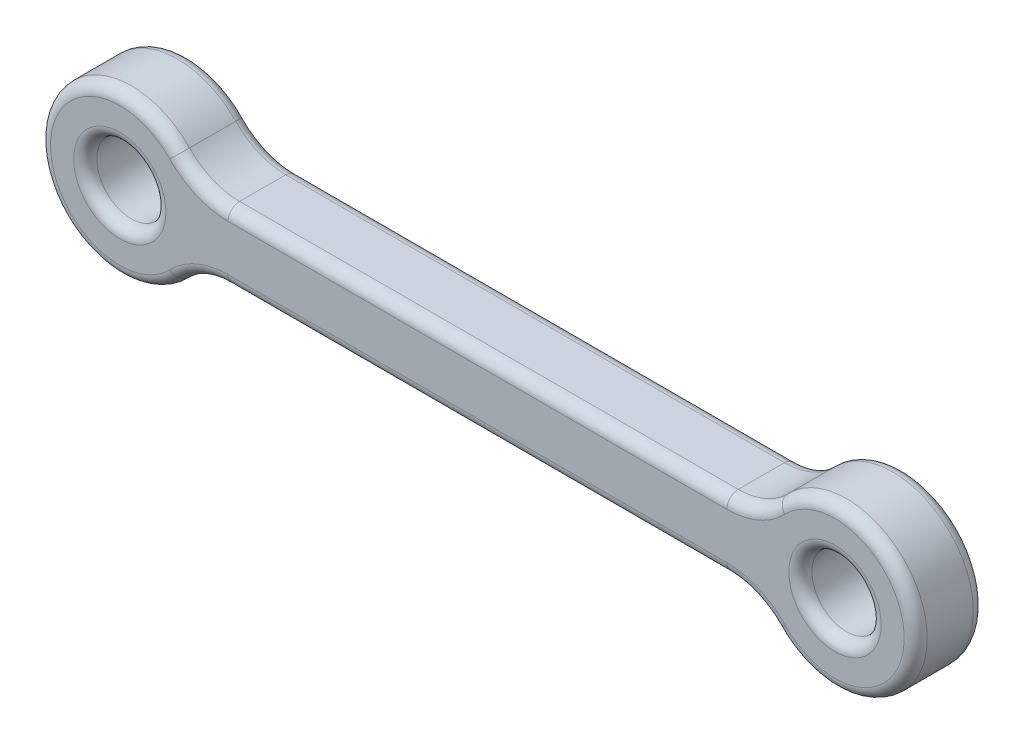
ISO-10303-21;
HEADER;
FILE_DESCRIPTION(('STEP AP214'),'2;1');
FILE_NAME('part.step','',(''),(''),'','','');
FILE_SCHEMA(('AUTOMOTIVE_DESIGN { 1 0 10303 214 1 1 1 1 }'));
ENDSEC;
DATA;
#1=APPLICATION_CONTEXT('core data for automotive mechanical design processes');
#2=APPLICATION_PROTOCOL_DEFINITION('international standard','automotive_design',2000,#1);
#3=PRODUCT_CONTEXT('',#1,'mechanical');
#4=PRODUCT('Part','Part','',(#3));
#5=PRODUCT_RELATED_PRODUCT_CATEGORY('part','',(#4));
#6=PRODUCT_DEFINITION_FORMATION('','',#4);
#7=PRODUCT_DEFINITION_CONTEXT('part definition',#1,'design');
#8=PRODUCT_DEFINITION('design','',#6,#7);
#9=PRODUCT_DEFINITION_SHAPE('','',#8);
#10=(LENGTH_UNIT() NAMED_UNIT(*) SI_UNIT(.MILLI.,.METRE.));
#11=(NAMED_UNIT(*) PLANE_ANGLE_UNIT() SI_UNIT($,.RADIAN.));
#12=(NAMED_UNIT(*) SI_UNIT($,.STERADIAN.) SOLID_ANGLE_UNIT());
#13=UNCERTAINTY_MEASURE_WITH_UNIT(LENGTH_MEASURE(1.E-05),#10,'distance_accuracy_value','');
#14=(GEOMETRIC_REPRESENTATION_CONTEXT(3) GLOBAL_UNCERTAINTY_ASSIGNED_CONTEXT((#13)) GLOBAL_UNIT_ASSIGNED_CONTEXT((#10,
#11,#12)) REPRESENTATION_CONTEXT('',''));
#15=CARTESIAN_POINT('',(0.,0.,0.));
#16=DIRECTION('',(0.,0.,1.));
#17=DIRECTION('',(1.,0.,0.));
#18=AXIS2_PLACEMENT_3D('',#15,#16,#17);
#19=CARTESIAN_POINT('',(26.3095842401766,4.5,-3.));
#20=DIRECTION('',(0.,0.,1.));
#21=DIRECTION('',(1.,0.,0.));
#22=AXIS2_PLACEMENT_3D('',#19,#20,#21);
#23=CYLINDRICAL_SURFACE('',#22,3.);
#24=DIRECTION('',(0.,0.,1.));
#25=VECTOR('',#24,1.);
#26=CARTESIAN_POINT('',(28.4743915139412,2.42307692307692,-3.));
#27=LINE('',#26,#25);
#28=CARTESIAN_POINT('',(28.4743915139412,2.42307692307692,-2.5));
#29=VERTEX_POINT('',#28);
#30=CARTESIAN_POINT('',(28.4743915139412,2.42307692307692,-0.5));
#31=VERTEX_POINT('',#30);
#32=EDGE_CURVE('E153',#29,#31,#27,.T.);
#33=ORIENTED_EDGE('',*,*,#32,.F.);
#34=CARTESIAN_POINT('',(26.3095842401766,4.5,-2.5));
#35=DIRECTION('',(0.,0.,1.));
#36=DIRECTION('',(1.,0.,0.));
#37=AXIS2_PLACEMENT_3D('',#34,#35,#36);
#38=CIRCLE('',#37,3.);
#39=CARTESIAN_POINT('',(26.3095842401766,1.5,-2.5));
#40=VERTEX_POINT('',#39);
#41=EDGE_CURVE('E168',#29,#40,#38,.F.);
#42=ORIENTED_EDGE('',*,*,#41,.T.);
#43=DIRECTION('',(0.,0.,1.));
#44=VECTOR('',#43,1.);
#45=CARTESIAN_POINT('',(26.3095842401766,1.5,-3.));
#46=LINE('',#45,#44);
#47=CARTESIAN_POINT('',(26.3095842401766,1.5,-0.5));
#48=VERTEX_POINT('',#47);
#49=EDGE_CURVE('E331',#40,#48,#46,.T.);
#50=ORIENTED_EDGE('',*,*,#49,.T.);
#51=CARTESIAN_POINT('',(26.3095842401766,4.5,-0.5));
#52=DIRECTION('',(0.,0.,1.));
#53=DIRECTION('',(1.,0.,0.));
#54=AXIS2_PLACEMENT_3D('',#51,#52,#53);
#55=CIRCLE('',#54,3.);
#56=EDGE_CURVE('E171',#48,#31,#55,.T.);
#57=ORIENTED_EDGE('',*,*,#56,.T.);
#58=EDGE_LOOP('',(#33,#42,#50,#57));
#59=FACE_BOUND('',#58,.T.);
#60=ADVANCED_FACE('F35',(#59),#23,.F.);
#61=CARTESIAN_POINT('',(31.,0.,-3.));
#62=DIRECTION('',(0.,0.,1.));
#63=DIRECTION('',(1.,0.,0.));
#64=AXIS2_PLACEMENT_3D('',#61,#62,#63);
#65=CYLINDRICAL_SURFACE('',#64,3.5);
#66=DIRECTION('',(0.,0.,1.));
#67=VECTOR('',#66,1.);
#68=CARTESIAN_POINT('',(28.4743915139412,-2.42307692307692,-3.));
#69=LINE('',#68,#67);
#70=CARTESIAN_POINT('',(28.4743915139412,-2.42307692307692,-2.5));
#71=VERTEX_POINT('',#70);
#72=CARTESIAN_POINT('',(28.4743915139412,-2.42307692307692,-0.5));
#73=VERTEX_POINT('',#72);
#74=EDGE_CURVE('E155',#71,#73,#69,.T.);
#75=ORIENTED_EDGE('',*,*,#74,.F.);
#76=CARTESIAN_POINT('',(31.,0.,-2.5));
#77=DIRECTION('',(0.,0.,1.));
#78=DIRECTION('',(1.,0.,0.));
#79=AXIS2_PLACEMENT_3D('',#76,#77,#78);
#80=CIRCLE('',#79,3.5);
#81=EDGE_CURVE('E150',#71,#29,#80,.T.);
#82=ORIENTED_EDGE('',*,*,#81,.T.);
#83=ORIENTED_EDGE('',*,*,#32,.T.);
#84=CARTESIAN_POINT('',(31.,0.,-0.5));
#85=DIRECTION('',(0.,0.,1.));
#86=DIRECTION('',(1.,0.,0.));
#87=AXIS2_PLACEMENT_3D('',#84,#85,#86);
#88=CIRCLE('',#87,3.5);
#89=EDGE_CURVE('E161',#31,#73,#88,.F.);
#90=ORIENTED_EDGE('',*,*,#89,.T.);
#91=EDGE_LOOP('',(#75,#82,#83,#90));
#92=FACE_BOUND('',#91,.T.);
#93=ADVANCED_FACE('F152',(#92),#65,.T.);
#94=CARTESIAN_POINT('',(26.3095842401766,-4.5,-3.));
#95=DIRECTION('',(0.,0.,1.));
#96=DIRECTION('',(1.,0.,0.));
#97=AXIS2_PLACEMENT_3D('',#94,#95,#96);
#98=CYLINDRICAL_SURFACE('',#97,3.);
#99=DIRECTION('',(0.,0.,1.));
#100=VECTOR('',#99,1.);
#101=CARTESIAN_POINT('',(26.3095842401766,-1.5,-3.));
#102=LINE('',#101,#100);
#103=CARTESIAN_POINT('',(26.3095842401766,-1.5,-2.5));
#104=VERTEX_POINT('',#103);
#105=CARTESIAN_POINT('',(26.3095842401766,-1.5,-0.5));
#106=VERTEX_POINT('',#105);
#107=EDGE_CURVE('E324',#104,#106,#102,.T.);
#108=ORIENTED_EDGE('',*,*,#107,.F.);
#109=CARTESIAN_POINT('',(26.3095842401766,-4.5,-2.5));
#110=DIRECTION('',(0.,0.,1.));
#111=DIRECTION('',(1.,0.,0.));
#112=AXIS2_PLACEMENT_3D('',#109,#110,#111);
#113=CIRCLE('',#112,3.);
#114=EDGE_CURVE('E210',#104,#71,#113,.F.);
#115=ORIENTED_EDGE('',*,*,#114,.T.);
#116=ORIENTED_EDGE('',*,*,#74,.T.);
#117=CARTESIAN_POINT('',(26.3095842401766,-4.5,-0.5));
#118=DIRECTION('',(0.,0.,1.));
#119=DIRECTION('',(1.,0.,0.));
#120=AXIS2_PLACEMENT_3D('',#117,#118,#119);
#121=CIRCLE('',#120,3.);
#122=EDGE_CURVE('E160',#73,#106,#121,.T.);
#123=ORIENTED_EDGE('',*,*,#122,.T.);
#124=EDGE_LOOP('',(#108,#115,#116,#123));
#125=FACE_BOUND('',#124,.T.);
#126=ADVANCED_FACE('F344',(#125),#98,.F.);
#127=CARTESIAN_POINT('',(4.69041575982343,-1.5,-3.));
#128=DIRECTION('',(0.,-1.,0.));
#129=DIRECTION('',(0.,0.,-1.));
#130=AXIS2_PLACEMENT_3D('',#127,#128,#129);
#131=PLANE('',#130);
#132=DIRECTION('',(0.,0.,1.));
#133=VECTOR('',#132,1.);
#134=CARTESIAN_POINT('',(4.69041575982343,-1.5,-3.));
#135=LINE('',#134,#133);
#136=CARTESIAN_POINT('',(4.69041575982343,-1.5,-2.5));
#137=VERTEX_POINT('',#136);
#138=CARTESIAN_POINT('',(4.69041575982343,-1.5,-0.5));
#139=VERTEX_POINT('',#138);
#140=EDGE_CURVE('E316',#137,#139,#135,.T.);
#141=ORIENTED_EDGE('',*,*,#140,.F.);
#142=DIRECTION('',(1.,0.,0.));
#143=VECTOR('',#142,1.);
#144=CARTESIAN_POINT('',(26.3095842401766,-1.5,-2.5));
#145=LINE('',#144,#143);
#146=EDGE_CURVE('E214',#137,#104,#145,.T.);
#147=ORIENTED_EDGE('',*,*,#146,.T.);
#148=ORIENTED_EDGE('',*,*,#107,.T.);
#149=DIRECTION('',(1.,0.,0.));
#150=VECTOR('',#149,1.);
#151=CARTESIAN_POINT('',(4.69041575982343,-1.5,-0.5));
#152=LINE('',#151,#150);
#153=EDGE_CURVE('E212',#106,#139,#152,.F.);
#154=ORIENTED_EDGE('',*,*,#153,.T.);
#155=EDGE_LOOP('',(#141,#147,#148,#154));
#156=FACE_BOUND('',#155,.T.);
#157=ADVANCED_FACE('F340',(#156),#131,.T.);
#158=CARTESIAN_POINT('',(4.69041575982343,-4.5,-3.));
#159=DIRECTION('',(0.,0.,1.));
#160=DIRECTION('',(1.,0.,0.));
#161=AXIS2_PLACEMENT_3D('',#158,#159,#160);
#162=CYLINDRICAL_SURFACE('',#161,3.);
#163=DIRECTION('',(0.,0.,1.));
#164=VECTOR('',#163,1.);
#165=CARTESIAN_POINT('',(2.52560848605877,-2.42307692307692,-3.));
#166=LINE('',#165,#164);
#167=CARTESIAN_POINT('',(2.52560848605877,-2.42307692307692,-2.5));
#168=VERTEX_POINT('',#167);
#169=CARTESIAN_POINT('',(2.52560848605877,-2.42307692307692,-0.5));
#170=VERTEX_POINT('',#169);
#171=EDGE_CURVE('E313',#168,#170,#166,.T.);
#172=ORIENTED_EDGE('',*,*,#171,.F.);
#173=CARTESIAN_POINT('',(4.69041575982343,-4.5,-2.5));
#174=DIRECTION('',(0.,0.,1.));
#175=DIRECTION('',(1.,0.,0.));
#176=AXIS2_PLACEMENT_3D('',#173,#174,#175);
#177=CIRCLE('',#176,3.);
#178=EDGE_CURVE('E218',#168,#137,#177,.F.);
#179=ORIENTED_EDGE('',*,*,#178,.T.);
#180=ORIENTED_EDGE('',*,*,#140,.T.);
#181=CARTESIAN_POINT('',(4.69041575982343,-4.5,-0.5));
#182=DIRECTION('',(0.,0.,1.));
#183=DIRECTION('',(1.,0.,0.));
#184=AXIS2_PLACEMENT_3D('',#181,#182,#183);
#185=CIRCLE('',#184,3.);
#186=EDGE_CURVE('E216',#139,#170,#185,.T.);
#187=ORIENTED_EDGE('',*,*,#186,.T.);
#188=EDGE_LOOP('',(#172,#179,#180,#187));
#189=FACE_BOUND('',#188,.T.);
#190=ADVANCED_FACE('F312',(#189),#162,.F.);
#191=CARTESIAN_POINT('',(0.,0.,-3.));
#192=DIRECTION('',(0.,0.,1.));
#193=DIRECTION('',(1.,0.,0.));
#194=AXIS2_PLACEMENT_3D('',#191,#192,#193);
#195=CYLINDRICAL_SURFACE('',#194,3.5);
#196=DIRECTION('',(0.,0.,1.));
#197=VECTOR('',#196,1.);
#198=CARTESIAN_POINT('',(2.52560848605877,2.42307692307692,-3.));
#199=LINE('',#198,#197);
#200=CARTESIAN_POINT('',(2.52560848605877,2.42307692307692,-2.5));
#201=VERTEX_POINT('',#200);
#202=CARTESIAN_POINT('',(2.52560848605877,2.42307692307692,-0.5));
#203=VERTEX_POINT('',#202);
#204=EDGE_CURVE('E322',#201,#203,#199,.T.);
#205=ORIENTED_EDGE('',*,*,#204,.F.);
#206=CARTESIAN_POINT('',(0.,0.,-2.5));
#207=DIRECTION('',(0.,0.,1.));
#208=DIRECTION('',(1.,0.,0.));
#209=AXIS2_PLACEMENT_3D('',#206,#207,#208);
#210=CIRCLE('',#209,3.5);
#211=EDGE_CURVE('E222',#201,#168,#210,.T.);
#212=ORIENTED_EDGE('',*,*,#211,.T.);
#213=ORIENTED_EDGE('',*,*,#171,.T.);
#214=CARTESIAN_POINT('',(0.,0.,-0.5));
#215=DIRECTION('',(0.,0.,1.));
#216=DIRECTION('',(1.,0.,0.));
#217=AXIS2_PLACEMENT_3D('',#214,#215,#216);
#218=CIRCLE('',#217,3.5);
#219=EDGE_CURVE('E220',#170,#203,#218,.F.);
#220=ORIENTED_EDGE('',*,*,#219,.T.);
#221=EDGE_LOOP('',(#205,#212,#213,#220));
#222=FACE_BOUND('',#221,.T.);
#223=ADVANCED_FACE('F319',(#222),#195,.T.);
#224=CARTESIAN_POINT('',(4.69041575982343,4.5,-3.));
#225=DIRECTION('',(0.,0.,1.));
#226=DIRECTION('',(1.,0.,0.));
#227=AXIS2_PLACEMENT_3D('',#224,#225,#226);
#228=CYLINDRICAL_SURFACE('',#227,3.);
#229=DIRECTION('',(0.,0.,1.));
#230=VECTOR('',#229,1.);
#231=CARTESIAN_POINT('',(4.69041575982343,1.5,-3.));
#232=LINE('',#231,#230);
#233=CARTESIAN_POINT('',(4.69041575982343,1.5,-2.5));
#234=VERTEX_POINT('',#233);
#235=CARTESIAN_POINT('',(4.69041575982343,1.5,-0.5));
#236=VERTEX_POINT('',#235);
#237=EDGE_CURVE('E326',#234,#236,#232,.T.);
#238=ORIENTED_EDGE('',*,*,#237,.F.);
#239=CARTESIAN_POINT('',(4.69041575982343,4.5,-2.5));
#240=DIRECTION('',(0.,0.,1.));
#241=DIRECTION('',(1.,0.,0.));
#242=AXIS2_PLACEMENT_3D('',#239,#240,#241);
#243=CIRCLE('',#242,3.);
#244=EDGE_CURVE('E226',#234,#201,#243,.F.);
#245=ORIENTED_EDGE('',*,*,#244,.T.);
#246=ORIENTED_EDGE('',*,*,#204,.T.);
#247=CARTESIAN_POINT('',(4.69041575982343,4.5,-0.5));
#248=DIRECTION('',(0.,0.,1.));
#249=DIRECTION('',(1.,0.,0.));
#250=AXIS2_PLACEMENT_3D('',#247,#248,#249);
#251=CIRCLE('',#250,3.);
#252=EDGE_CURVE('E224',#203,#236,#251,.T.);
#253=ORIENTED_EDGE('',*,*,#252,.T.);
#254=EDGE_LOOP('',(#238,#245,#246,#253));
#255=FACE_BOUND('',#254,.T.);
#256=ADVANCED_FACE('F366',(#255),#228,.F.);
#257=CARTESIAN_POINT('',(4.69041575982343,1.5,-3.));
#258=DIRECTION('',(0.,1.,0.));
#259=DIRECTION('',(0.,0.,1.));
#260=AXIS2_PLACEMENT_3D('',#257,#258,#259);
#261=PLANE('',#260);
#262=ORIENTED_EDGE('',*,*,#49,.F.);
#263=DIRECTION('',(-1.,0.,0.));
#264=VECTOR('',#263,1.);
#265=CARTESIAN_POINT('',(4.69041575982343,1.5,-2.5));
#266=LINE('',#265,#264);
#267=EDGE_CURVE('E11',#40,#234,#266,.T.);
#268=ORIENTED_EDGE('',*,*,#267,.T.);
#269=ORIENTED_EDGE('',*,*,#237,.T.);
#270=DIRECTION('',(-1.,0.,0.));
#271=VECTOR('',#270,1.);
#272=CARTESIAN_POINT('',(4.69041575982343,1.5,-0.5));
#273=LINE('',#272,#271);
#274=EDGE_CURVE('E44',#236,#48,#273,.F.);
#275=ORIENTED_EDGE('',*,*,#274,.T.);
#276=EDGE_LOOP('',(#262,#268,#269,#275));
#277=FACE_BOUND('',#276,.T.);
#278=ADVANCED_FACE('F362',(#277),#261,.T.);
#279=CARTESIAN_POINT('',(26.3095842401766,4.5,-3.));
#280=DIRECTION('',(0.,0.,1.));
#281=DIRECTION('',(1.,0.,0.));
#282=AXIS2_PLACEMENT_3D('',#279,#280,#281);
#283=PLANE('',#282);
#284=CARTESIAN_POINT('',(31.,0.,-3.));
#285=DIRECTION('',(0.,0.,1.));
#286=DIRECTION('',(1.,0.,0.));
#287=AXIS2_PLACEMENT_3D('',#284,#285,#286);
#288=CIRCLE('',#287,2.);
#289=CARTESIAN_POINT('',(33.,0.,-3.));
#290=VERTEX_POINT('',#289);
#291=EDGE_CURVE('E205',#290,#290,#288,.T.);
#292=ORIENTED_EDGE('',*,*,#291,.T.);
#293=EDGE_LOOP('',(#292));
#294=FACE_BOUND('',#293,.T.);
#295=DIRECTION('',(-1.,0.,0.));
#296=VECTOR('',#295,1.);
#297=CARTESIAN_POINT('',(26.3095842401766,1.,-3.));
#298=LINE('',#297,#296);
#299=CARTESIAN_POINT('',(4.69041575982343,1.,-3.));
#300=VERTEX_POINT('',#299);
#301=CARTESIAN_POINT('',(26.3095842401766,1.,-3.));
#302=VERTEX_POINT('',#301);
#303=EDGE_CURVE('E186',#300,#302,#298,.F.);
#304=ORIENTED_EDGE('',*,*,#303,.T.);
#305=CARTESIAN_POINT('',(26.3095842401766,4.5,-3.));
#306=DIRECTION('',(0.,0.,1.));
#307=DIRECTION('',(1.,0.,0.));
#308=AXIS2_PLACEMENT_3D('',#305,#306,#307);
#309=CIRCLE('',#308,3.5);
#310=CARTESIAN_POINT('',(28.8351927262353,2.07692307692308,-3.));
#311=VERTEX_POINT('',#310);
#312=EDGE_CURVE('E203',#302,#311,#309,.T.);
#313=ORIENTED_EDGE('',*,*,#312,.T.);
#314=CARTESIAN_POINT('',(31.,0.,-3.));
#315=DIRECTION('',(0.,0.,1.));
#316=DIRECTION('',(1.,0.,0.));
#317=AXIS2_PLACEMENT_3D('',#314,#315,#316);
#318=CIRCLE('',#317,3.);
#319=CARTESIAN_POINT('',(28.8351927262353,-2.07692307692308,-3.));
#320=VERTEX_POINT('',#319);
#321=EDGE_CURVE('E176',#311,#320,#318,.F.);
#322=ORIENTED_EDGE('',*,*,#321,.T.);
#323=CARTESIAN_POINT('',(26.3095842401766,-4.5,-3.));
#324=DIRECTION('',(0.,0.,1.));
#325=DIRECTION('',(1.,0.,0.));
#326=AXIS2_PLACEMENT_3D('',#323,#324,#325);
#327=CIRCLE('',#326,3.5);
#328=CARTESIAN_POINT('',(26.3095842401766,-1.,-3.));
#329=VERTEX_POINT('',#328);
#330=EDGE_CURVE('E200',#320,#329,#327,.T.);
#331=ORIENTED_EDGE('',*,*,#330,.T.);
#332=DIRECTION('',(1.,0.,0.));
#333=VECTOR('',#332,1.);
#334=CARTESIAN_POINT('',(4.69041575982343,-1.,-3.));
#335=LINE('',#334,#333);
#336=CARTESIAN_POINT('',(4.69041575982343,-1.,-3.));
#337=VERTEX_POINT('',#336);
#338=EDGE_CURVE('E198',#329,#337,#335,.F.);
#339=ORIENTED_EDGE('',*,*,#338,.T.);
#340=CARTESIAN_POINT('',(4.69041575982343,-4.5,-3.));
#341=DIRECTION('',(0.,0.,1.));
#342=DIRECTION('',(1.,0.,0.));
#343=AXIS2_PLACEMENT_3D('',#340,#341,#342);
#344=CIRCLE('',#343,3.5);
#345=CARTESIAN_POINT('',(2.16480727376466,-2.07692307692308,-3.));
#346=VERTEX_POINT('',#345);
#347=EDGE_CURVE('E196',#337,#346,#344,.T.);
#348=ORIENTED_EDGE('',*,*,#347,.T.);
#349=CARTESIAN_POINT('',(0.,0.,-3.));
#350=DIRECTION('',(0.,0.,1.));
#351=DIRECTION('',(1.,0.,0.));
#352=AXIS2_PLACEMENT_3D('',#349,#350,#351);
#353=CIRCLE('',#352,3.);
#354=CARTESIAN_POINT('',(2.16480727376466,2.07692307692308,-3.));
#355=VERTEX_POINT('',#354);
#356=EDGE_CURVE('E194',#346,#355,#353,.F.);
#357=ORIENTED_EDGE('',*,*,#356,.T.);
#358=CARTESIAN_POINT('',(4.69041575982343,4.5,-3.));
#359=DIRECTION('',(0.,0.,1.));
#360=DIRECTION('',(1.,0.,0.));
#361=AXIS2_PLACEMENT_3D('',#358,#359,#360);
#362=CIRCLE('',#361,3.5);
#363=EDGE_CURVE('E188',#355,#300,#362,.T.);
#364=ORIENTED_EDGE('',*,*,#363,.T.);
#365=EDGE_LOOP('',(#304,#313,#322,#331,#339,#348,#357,#364));
#366=FACE_BOUND('',#365,.T.);
#367=CARTESIAN_POINT('',(0.,0.,-3.));
#368=DIRECTION('',(0.,0.,1.));
#369=DIRECTION('',(1.,0.,0.));
#370=AXIS2_PLACEMENT_3D('',#367,#368,#369);
#371=CIRCLE('',#370,1.5);
#372=CARTESIAN_POINT('',(1.5,0.,-3.));
#373=VERTEX_POINT('',#372);
#374=EDGE_CURVE('E275',#373,#373,#371,.T.);
#375=ORIENTED_EDGE('',*,*,#374,.T.);
#376=EDGE_LOOP('',(#375));
#377=FACE_BOUND('',#376,.T.);
#378=ADVANCED_FACE('F354',(#294,#366,#377),#283,.F.);
#379=CARTESIAN_POINT('',(26.3095842401766,4.5,0.));
#380=DIRECTION('',(0.,0.,1.));
#381=DIRECTION('',(1.,0.,0.));
#382=AXIS2_PLACEMENT_3D('',#379,#380,#381);
#383=PLANE('',#382);
#384=CARTESIAN_POINT('',(0.,0.,0.));
#385=DIRECTION('',(0.,0.,1.));
#386=DIRECTION('',(1.,0.,0.));
#387=AXIS2_PLACEMENT_3D('',#384,#385,#386);
#388=CIRCLE('',#387,2.);
#389=CARTESIAN_POINT('',(2.,0.,0.));
#390=VERTEX_POINT('',#389);
#391=EDGE_CURVE('E245',#390,#390,#388,.F.);
#392=ORIENTED_EDGE('',*,*,#391,.T.);
#393=EDGE_LOOP('',(#392));
#394=FACE_BOUND('',#393,.T.);
#395=CARTESIAN_POINT('',(31.,0.,0.));
#396=DIRECTION('',(0.,0.,1.));
#397=DIRECTION('',(1.,0.,0.));
#398=AXIS2_PLACEMENT_3D('',#395,#396,#397);
#399=CIRCLE('',#398,2.);
#400=CARTESIAN_POINT('',(33.,0.,0.));
#401=VERTEX_POINT('',#400);
#402=EDGE_CURVE('E242',#401,#401,#399,.F.);
#403=ORIENTED_EDGE('',*,*,#402,.T.);
#404=EDGE_LOOP('',(#403));
#405=FACE_BOUND('',#404,.T.);
#406=CARTESIAN_POINT('',(31.,0.,0.));
#407=DIRECTION('',(0.,0.,1.));
#408=DIRECTION('',(1.,0.,0.));
#409=AXIS2_PLACEMENT_3D('',#406,#407,#408);
#410=CIRCLE('',#409,3.);
#411=CARTESIAN_POINT('',(28.8351927262353,-2.07692307692308,0.));
#412=VERTEX_POINT('',#411);
#413=CARTESIAN_POINT('',(28.8351927262353,2.07692307692308,0.));
#414=VERTEX_POINT('',#413);
#415=EDGE_CURVE('E52',#412,#414,#410,.T.);
#416=ORIENTED_EDGE('',*,*,#415,.T.);
#417=CARTESIAN_POINT('',(26.3095842401766,4.5,0.));
#418=DIRECTION('',(0.,0.,1.));
#419=DIRECTION('',(1.,0.,0.));
#420=AXIS2_PLACEMENT_3D('',#417,#418,#419);
#421=CIRCLE('',#420,3.5);
#422=CARTESIAN_POINT('',(26.3095842401766,1.,0.));
#423=VERTEX_POINT('',#422);
#424=EDGE_CURVE('E240',#414,#423,#421,.F.);
#425=ORIENTED_EDGE('',*,*,#424,.T.);
#426=DIRECTION('',(-1.,0.,0.));
#427=VECTOR('',#426,1.);
#428=CARTESIAN_POINT('',(26.3095842401766,1.,0.));
#429=LINE('',#428,#427);
#430=CARTESIAN_POINT('',(4.69041575982343,1.,0.));
#431=VERTEX_POINT('',#430);
#432=EDGE_CURVE('E228',#423,#431,#429,.T.);
#433=ORIENTED_EDGE('',*,*,#432,.T.);
#434=CARTESIAN_POINT('',(4.69041575982343,4.5,0.));
#435=DIRECTION('',(0.,0.,1.));
#436=DIRECTION('',(1.,0.,0.));
#437=AXIS2_PLACEMENT_3D('',#434,#435,#436);
#438=CIRCLE('',#437,3.5);
#439=CARTESIAN_POINT('',(2.16480727376466,2.07692307692308,0.));
#440=VERTEX_POINT('',#439);
#441=EDGE_CURVE('E230',#431,#440,#438,.F.);
#442=ORIENTED_EDGE('',*,*,#441,.T.);
#443=CARTESIAN_POINT('',(0.,0.,0.));
#444=DIRECTION('',(0.,0.,1.));
#445=DIRECTION('',(1.,0.,0.));
#446=AXIS2_PLACEMENT_3D('',#443,#444,#445);
#447=CIRCLE('',#446,3.);
#448=CARTESIAN_POINT('',(2.16480727376466,-2.07692307692308,0.));
#449=VERTEX_POINT('',#448);
#450=EDGE_CURVE('E232',#440,#449,#447,.T.);
#451=ORIENTED_EDGE('',*,*,#450,.T.);
#452=CARTESIAN_POINT('',(4.69041575982343,-4.5,0.));
#453=DIRECTION('',(0.,0.,1.));
#454=DIRECTION('',(1.,0.,0.));
#455=AXIS2_PLACEMENT_3D('',#452,#453,#454);
#456=CIRCLE('',#455,3.5);
#457=CARTESIAN_POINT('',(4.69041575982343,-1.,0.));
#458=VERTEX_POINT('',#457);
#459=EDGE_CURVE('E234',#449,#458,#456,.F.);
#460=ORIENTED_EDGE('',*,*,#459,.T.);
#461=DIRECTION('',(1.,0.,0.));
#462=VECTOR('',#461,1.);
#463=CARTESIAN_POINT('',(26.3095842401766,-1.,0.));
#464=LINE('',#463,#462);
#465=CARTESIAN_POINT('',(26.3095842401766,-1.,0.));
#466=VERTEX_POINT('',#465);
#467=EDGE_CURVE('E236',#458,#466,#464,.T.);
#468=ORIENTED_EDGE('',*,*,#467,.T.);
#469=CARTESIAN_POINT('',(26.3095842401766,-4.5,0.));
#470=DIRECTION('',(0.,0.,1.));
#471=DIRECTION('',(1.,0.,0.));
#472=AXIS2_PLACEMENT_3D('',#469,#470,#471);
#473=CIRCLE('',#472,3.5);
#474=EDGE_CURVE('E57',#466,#412,#473,.F.);
#475=ORIENTED_EDGE('',*,*,#474,.T.);
#476=EDGE_LOOP('',(#416,#425,#433,#442,#451,#460,#468,#475));
#477=FACE_BOUND('',#476,.T.);
#478=ADVANCED_FACE('F569',(#394,#405,#477),#383,.T.);
#479=CARTESIAN_POINT('',(0.,0.,-3.));
#480=DIRECTION('',(0.,0.,1.));
#481=DIRECTION('',(1.,0.,0.));
#482=AXIS2_PLACEMENT_3D('',#479,#480,#481);
#483=CYLINDRICAL_SURFACE('',#482,1.5);
#484=CARTESIAN_POINT('',(0.,0.,-0.5));
#485=DIRECTION('',(0.,0.,1.));
#486=DIRECTION('',(1.,0.,0.));
#487=AXIS2_PLACEMENT_3D('',#484,#485,#486);
#488=CIRCLE('',#487,1.5);
#489=CARTESIAN_POINT('',(1.5,0.,-0.5));
#490=VERTEX_POINT('',#489);
#491=EDGE_CURVE('E248',#490,#490,#488,.T.);
#492=ORIENTED_EDGE('',*,*,#491,.T.);
#493=EDGE_LOOP('',(#492));
#494=FACE_BOUND('',#493,.T.);
#495=ORIENTED_EDGE('',*,*,#374,.F.);
#496=EDGE_LOOP('',(#495));
#497=FACE_BOUND('',#496,.T.);
#498=ADVANCED_FACE('F387',(#494,#497),#483,.F.);
#499=CARTESIAN_POINT('',(31.,0.,-3.));
#500=DIRECTION('',(0.,0.,1.));
#501=DIRECTION('',(1.,0.,0.));
#502=AXIS2_PLACEMENT_3D('',#499,#500,#501);
#503=CYLINDRICAL_SURFACE('',#502,1.5);
#504=CARTESIAN_POINT('',(31.,0.,-2.5));
#505=DIRECTION('',(0.,0.,1.));
#506=DIRECTION('',(1.,0.,0.));
#507=AXIS2_PLACEMENT_3D('',#504,#505,#506);
#508=CIRCLE('',#507,1.5);
#509=CARTESIAN_POINT('',(32.5,0.,-2.5));
#510=VERTEX_POINT('',#509);
#511=EDGE_CURVE('E254',#510,#510,#508,.F.);
#512=ORIENTED_EDGE('',*,*,#511,.T.);
#513=EDGE_LOOP('',(#512));
#514=FACE_BOUND('',#513,.T.);
#515=CARTESIAN_POINT('',(31.,0.,-0.5));
#516=DIRECTION('',(0.,0.,1.));
#517=DIRECTION('',(1.,0.,0.));
#518=AXIS2_PLACEMENT_3D('',#515,#516,#517);
#519=CIRCLE('',#518,1.5);
#520=CARTESIAN_POINT('',(32.5,0.,-0.5));
#521=VERTEX_POINT('',#520);
#522=EDGE_CURVE('E251',#521,#521,#519,.T.);
#523=ORIENTED_EDGE('',*,*,#522,.T.);
#524=EDGE_LOOP('',(#523));
#525=FACE_BOUND('',#524,.T.);
#526=ADVANCED_FACE('F380',(#514,#525),#503,.F.);
#527=CARTESIAN_POINT('',(4.69041575982343,-4.5,-2.5));
#528=DIRECTION('',(0.,0.,1.));
#529=DIRECTION('',(1.,0.,0.));
#530=AXIS2_PLACEMENT_3D('',#527,#528,#529);
#531=TOROIDAL_SURFACE('',#530,3.5,0.5);
#532=CARTESIAN_POINT('',(2.16480727376466,-2.07692307692308,-2.5));
#533=DIRECTION('',(-0.692307692307692,-0.72160242458822,0.));
#534=DIRECTION('',(0.72160242458822,-0.692307692307692,0.));
#535=AXIS2_PLACEMENT_3D('',#532,#533,#534);
#536=CIRCLE('',#535,0.5);
#537=EDGE_CURVE('E269',#346,#168,#536,.T.);
#538=ORIENTED_EDGE('',*,*,#537,.F.);
#539=ORIENTED_EDGE('',*,*,#347,.F.);
#540=CARTESIAN_POINT('',(4.69041575982343,-1.,-2.5));
#541=DIRECTION('',(1.,0.,0.));
#542=DIRECTION('',(0.,0.,-1.));
#543=AXIS2_PLACEMENT_3D('',#540,#541,#542);
#544=CIRCLE('',#543,0.5);
#545=EDGE_CURVE('E272',#137,#337,#544,.T.);
#546=ORIENTED_EDGE('',*,*,#545,.F.);
#547=ORIENTED_EDGE('',*,*,#178,.F.);
#548=EDGE_LOOP('',(#538,#539,#546,#547));
#549=FACE_BOUND('',#548,.T.);
#550=ADVANCED_FACE('F377',(#549),#531,.T.);
#551=CARTESIAN_POINT('',(4.69041575982343,-1.,-2.5));
#552=DIRECTION('',(-1.,0.,0.));
#553=DIRECTION('',(0.,0.,1.));
#554=AXIS2_PLACEMENT_3D('',#551,#552,#553);
#555=CYLINDRICAL_SURFACE('',#554,0.5);
#556=ORIENTED_EDGE('',*,*,#545,.T.);
#557=ORIENTED_EDGE('',*,*,#338,.F.);
#558=CARTESIAN_POINT('',(26.3095842401766,-1.,-2.5));
#559=DIRECTION('',(1.,0.,0.));
#560=DIRECTION('',(0.,0.,-1.));
#561=AXIS2_PLACEMENT_3D('',#558,#559,#560);
#562=CIRCLE('',#561,0.5);
#563=EDGE_CURVE('E266',#104,#329,#562,.T.);
#564=ORIENTED_EDGE('',*,*,#563,.F.);
#565=ORIENTED_EDGE('',*,*,#146,.F.);
#566=EDGE_LOOP('',(#556,#557,#564,#565));
#567=FACE_BOUND('',#566,.T.);
#568=ADVANCED_FACE('F349',(#567),#555,.T.);
#569=CARTESIAN_POINT('',(0.,0.,-2.5));
#570=DIRECTION('',(0.,0.,1.));
#571=DIRECTION('',(1.,0.,0.));
#572=AXIS2_PLACEMENT_3D('',#569,#570,#571);
#573=TOROIDAL_SURFACE('',#572,3.,0.5);
#574=ORIENTED_EDGE('',*,*,#537,.T.);
#575=ORIENTED_EDGE('',*,*,#211,.F.);
#576=CARTESIAN_POINT('',(2.16480727376466,2.07692307692308,-2.5));
#577=DIRECTION('',(0.692307692307693,-0.72160242458822,0.));
#578=DIRECTION('',(0.72160242458822,0.692307692307693,0.));
#579=AXIS2_PLACEMENT_3D('',#576,#577,#578);
#580=CIRCLE('',#579,0.5);
#581=EDGE_CURVE('E263',#355,#201,#580,.T.);
#582=ORIENTED_EDGE('',*,*,#581,.F.);
#583=ORIENTED_EDGE('',*,*,#356,.F.);
#584=EDGE_LOOP('',(#574,#575,#582,#583));
#585=FACE_BOUND('',#584,.T.);
#586=ADVANCED_FACE('F374',(#585),#573,.T.);
#587=CARTESIAN_POINT('',(26.3095842401766,-4.5,-2.5));
#588=DIRECTION('',(0.,0.,1.));
#589=DIRECTION('',(1.,0.,0.));
#590=AXIS2_PLACEMENT_3D('',#587,#588,#589);
#591=TOROIDAL_SURFACE('',#590,3.5,0.5);
#592=ORIENTED_EDGE('',*,*,#563,.T.);
#593=ORIENTED_EDGE('',*,*,#330,.F.);
#594=CARTESIAN_POINT('',(28.8351927262353,-2.07692307692308,-2.5));
#595=DIRECTION('',(0.692307692307692,-0.72160242458822,0.));
#596=DIRECTION('',(0.72160242458822,0.692307692307692,0.));
#597=AXIS2_PLACEMENT_3D('',#594,#595,#596);
#598=CIRCLE('',#597,0.5);
#599=EDGE_CURVE('E261',#71,#320,#598,.T.);
#600=ORIENTED_EDGE('',*,*,#599,.F.);
#601=ORIENTED_EDGE('',*,*,#114,.F.);
#602=EDGE_LOOP('',(#592,#593,#600,#601));
#603=FACE_BOUND('',#602,.T.);
#604=ADVANCED_FACE('F352',(#603),#591,.T.);
#605=CARTESIAN_POINT('',(4.69041575982343,4.5,-2.5));
#606=DIRECTION('',(0.,0.,1.));
#607=DIRECTION('',(1.,0.,0.));
#608=AXIS2_PLACEMENT_3D('',#605,#606,#607);
#609=TOROIDAL_SURFACE('',#608,3.5,0.5);
#610=ORIENTED_EDGE('',*,*,#581,.T.);
#611=ORIENTED_EDGE('',*,*,#244,.F.);
#612=CARTESIAN_POINT('',(4.69041575982343,1.,-2.5));
#613=DIRECTION('',(1.,0.,0.));
#614=DIRECTION('',(0.,0.,-1.));
#615=AXIS2_PLACEMENT_3D('',#612,#613,#614);
#616=CIRCLE('',#615,0.5);
#617=EDGE_CURVE('E180',#300,#234,#616,.T.);
#618=ORIENTED_EDGE('',*,*,#617,.F.);
#619=ORIENTED_EDGE('',*,*,#363,.F.);
#620=EDGE_LOOP('',(#610,#611,#618,#619));
#621=FACE_BOUND('',#620,.T.);
#622=ADVANCED_FACE('F369',(#621),#609,.T.);
#623=CARTESIAN_POINT('',(31.,0.,-2.5));
#624=DIRECTION('',(0.,0.,1.));
#625=DIRECTION('',(1.,0.,0.));
#626=AXIS2_PLACEMENT_3D('',#623,#624,#625);
#627=TOROIDAL_SURFACE('',#626,3.,0.5);
#628=ORIENTED_EDGE('',*,*,#599,.T.);
#629=ORIENTED_EDGE('',*,*,#321,.F.);
#630=CARTESIAN_POINT('',(28.8351927262353,2.07692307692308,-2.5));
#631=DIRECTION('',(-0.692307692307692,-0.72160242458822,0.));
#632=DIRECTION('',(0.72160242458822,-0.692307692307692,0.));
#633=AXIS2_PLACEMENT_3D('',#630,#631,#632);
#634=CIRCLE('',#633,0.5);
#635=EDGE_CURVE('E174',#29,#311,#634,.T.);
#636=ORIENTED_EDGE('',*,*,#635,.F.);
#637=ORIENTED_EDGE('',*,*,#81,.F.);
#638=EDGE_LOOP('',(#628,#629,#636,#637));
#639=FACE_BOUND('',#638,.T.);
#640=ADVANCED_FACE('F175',(#639),#627,.T.);
#641=CARTESIAN_POINT('',(4.69041575982343,1.,-2.5));
#642=DIRECTION('',(1.,0.,0.));
#643=DIRECTION('',(0.,0.,-1.));
#644=AXIS2_PLACEMENT_3D('',#641,#642,#643);
#645=CYLINDRICAL_SURFACE('',#644,0.5);
#646=ORIENTED_EDGE('',*,*,#617,.T.);
#647=ORIENTED_EDGE('',*,*,#267,.F.);
#648=CARTESIAN_POINT('',(26.3095842401766,1.,-2.5));
#649=DIRECTION('',(1.,0.,0.));
#650=DIRECTION('',(0.,0.,-1.));
#651=AXIS2_PLACEMENT_3D('',#648,#649,#650);
#652=CIRCLE('',#651,0.5);
#653=EDGE_CURVE('E181',#302,#40,#652,.T.);
#654=ORIENTED_EDGE('',*,*,#653,.F.);
#655=ORIENTED_EDGE('',*,*,#303,.F.);
#656=EDGE_LOOP('',(#646,#647,#654,#655));
#657=FACE_BOUND('',#656,.T.);
#658=ADVANCED_FACE('F358',(#657),#645,.T.);
#659=CARTESIAN_POINT('',(26.3095842401766,4.5,-2.5));
#660=DIRECTION('',(0.,0.,1.));
#661=DIRECTION('',(1.,0.,0.));
#662=AXIS2_PLACEMENT_3D('',#659,#660,#661);
#663=TOROIDAL_SURFACE('',#662,3.5,0.5);
#664=ORIENTED_EDGE('',*,*,#635,.T.);
#665=ORIENTED_EDGE('',*,*,#312,.F.);
#666=ORIENTED_EDGE('',*,*,#653,.T.);
#667=ORIENTED_EDGE('',*,*,#41,.F.);
#668=EDGE_LOOP('',(#664,#665,#666,#667));
#669=FACE_BOUND('',#668,.T.);
#670=ADVANCED_FACE('F183',(#669),#663,.T.);
#671=CARTESIAN_POINT('',(4.69041575982343,-4.5,-0.5));
#672=DIRECTION('',(0.,0.,1.));
#673=DIRECTION('',(1.,0.,0.));
#674=AXIS2_PLACEMENT_3D('',#671,#672,#673);
#675=TOROIDAL_SURFACE('',#674,3.5,0.5);
#676=CARTESIAN_POINT('',(2.16480727376466,-2.07692307692308,-0.5));
#677=DIRECTION('',(-0.692307692307692,-0.72160242458822,0.));
#678=DIRECTION('',(0.72160242458822,-0.692307692307692,0.));
#679=AXIS2_PLACEMENT_3D('',#676,#677,#678);
#680=CIRCLE('',#679,0.5);
#681=EDGE_CURVE('E291',#170,#449,#680,.T.);
#682=ORIENTED_EDGE('',*,*,#681,.F.);
#683=ORIENTED_EDGE('',*,*,#186,.F.);
#684=CARTESIAN_POINT('',(4.69041575982343,-1.,-0.5));
#685=DIRECTION('',(1.,0.,0.));
#686=DIRECTION('',(0.,0.,-1.));
#687=AXIS2_PLACEMENT_3D('',#684,#685,#686);
#688=CIRCLE('',#687,0.5);
#689=EDGE_CURVE('E39',#458,#139,#688,.T.);
#690=ORIENTED_EDGE('',*,*,#689,.F.);
#691=ORIENTED_EDGE('',*,*,#459,.F.);
#692=EDGE_LOOP('',(#682,#683,#690,#691));
#693=FACE_BOUND('',#692,.T.);
#694=ADVANCED_FACE('F307',(#693),#675,.T.);
#695=CARTESIAN_POINT('',(26.3095842401766,-1.,-0.5));
#696=DIRECTION('',(1.,0.,0.));
#697=DIRECTION('',(0.,0.,-1.));
#698=AXIS2_PLACEMENT_3D('',#695,#696,#697);
#699=CYLINDRICAL_SURFACE('',#698,0.5);
#700=ORIENTED_EDGE('',*,*,#689,.T.);
#701=ORIENTED_EDGE('',*,*,#153,.F.);
#702=CARTESIAN_POINT('',(26.3095842401766,-1.,-0.5));
#703=DIRECTION('',(1.,0.,0.));
#704=DIRECTION('',(0.,0.,-1.));
#705=AXIS2_PLACEMENT_3D('',#702,#703,#704);
#706=CIRCLE('',#705,0.5);
#707=EDGE_CURVE('E289',#466,#106,#706,.T.);
#708=ORIENTED_EDGE('',*,*,#707,.F.);
#709=ORIENTED_EDGE('',*,*,#467,.F.);
#710=EDGE_LOOP('',(#700,#701,#708,#709));
#711=FACE_BOUND('',#710,.T.);
#712=ADVANCED_FACE('F302',(#711),#699,.T.);
#713=CARTESIAN_POINT('',(0.,0.,-0.5));
#714=DIRECTION('',(0.,0.,1.));
#715=DIRECTION('',(1.,0.,0.));
#716=AXIS2_PLACEMENT_3D('',#713,#714,#715);
#717=TOROIDAL_SURFACE('',#716,3.,0.5);
#718=ORIENTED_EDGE('',*,*,#681,.T.);
#719=ORIENTED_EDGE('',*,*,#450,.F.);
#720=CARTESIAN_POINT('',(2.16480727376466,2.07692307692308,-0.5));
#721=DIRECTION('',(0.692307692307693,-0.72160242458822,0.));
#722=DIRECTION('',(0.72160242458822,0.692307692307693,0.));
#723=AXIS2_PLACEMENT_3D('',#720,#721,#722);
#724=CIRCLE('',#723,0.5);
#725=EDGE_CURVE('E286',#203,#440,#724,.T.);
#726=ORIENTED_EDGE('',*,*,#725,.F.);
#727=ORIENTED_EDGE('',*,*,#219,.F.);
#728=EDGE_LOOP('',(#718,#719,#726,#727));
#729=FACE_BOUND('',#728,.T.);
#730=ADVANCED_FACE('F447',(#729),#717,.T.);
#731=CARTESIAN_POINT('',(26.3095842401766,-4.5,-0.5));
#732=DIRECTION('',(0.,0.,1.));
#733=DIRECTION('',(1.,0.,0.));
#734=AXIS2_PLACEMENT_3D('',#731,#732,#733);
#735=TOROIDAL_SURFACE('',#734,3.5,0.5);
#736=ORIENTED_EDGE('',*,*,#707,.T.);
#737=ORIENTED_EDGE('',*,*,#122,.F.);
#738=CARTESIAN_POINT('',(28.8351927262353,-2.07692307692308,-0.5));
#739=DIRECTION('',(0.692307692307691,-0.721602424588221,0.));
#740=DIRECTION('',(0.721602424588221,0.692307692307691,0.));
#741=AXIS2_PLACEMENT_3D('',#738,#739,#740);
#742=CIRCLE('',#741,0.5);
#743=EDGE_CURVE('E283',#412,#73,#742,.T.);
#744=ORIENTED_EDGE('',*,*,#743,.F.);
#745=ORIENTED_EDGE('',*,*,#474,.F.);
#746=EDGE_LOOP('',(#736,#737,#744,#745));
#747=FACE_BOUND('',#746,.T.);
#748=ADVANCED_FACE('F454',(#747),#735,.T.);
#749=CARTESIAN_POINT('',(4.69041575982343,4.5,-0.5));
#750=DIRECTION('',(0.,0.,1.));
#751=DIRECTION('',(1.,0.,0.));
#752=AXIS2_PLACEMENT_3D('',#749,#750,#751);
#753=TOROIDAL_SURFACE('',#752,3.5,0.5);
#754=ORIENTED_EDGE('',*,*,#725,.T.);
#755=ORIENTED_EDGE('',*,*,#441,.F.);
#756=CARTESIAN_POINT('',(4.69041575982343,1.,-0.5));
#757=DIRECTION('',(1.,0.,0.));
#758=DIRECTION('',(0.,0.,-1.));
#759=AXIS2_PLACEMENT_3D('',#756,#757,#758);
#760=CIRCLE('',#759,0.5);
#761=EDGE_CURVE('E280',#236,#431,#760,.T.);
#762=ORIENTED_EDGE('',*,*,#761,.F.);
#763=ORIENTED_EDGE('',*,*,#252,.F.);
#764=EDGE_LOOP('',(#754,#755,#762,#763));
#765=FACE_BOUND('',#764,.T.);
#766=ADVANCED_FACE('F461',(#765),#753,.T.);
#767=CARTESIAN_POINT('',(31.,0.,-0.5));
#768=DIRECTION('',(0.,0.,1.));
#769=DIRECTION('',(1.,0.,0.));
#770=AXIS2_PLACEMENT_3D('',#767,#768,#769);
#771=TOROIDAL_SURFACE('',#770,3.,0.5);
#772=ORIENTED_EDGE('',*,*,#743,.T.);
#773=ORIENTED_EDGE('',*,*,#89,.F.);
#774=CARTESIAN_POINT('',(28.8351927262353,2.07692307692308,-0.5));
#775=DIRECTION('',(-0.692307692307693,-0.72160242458822,0.));
#776=DIRECTION('',(0.72160242458822,-0.692307692307693,0.));
#777=AXIS2_PLACEMENT_3D('',#774,#775,#776);
#778=CIRCLE('',#777,0.5);
#779=EDGE_CURVE('E278',#414,#31,#778,.T.);
#780=ORIENTED_EDGE('',*,*,#779,.F.);
#781=ORIENTED_EDGE('',*,*,#415,.F.);
#782=EDGE_LOOP('',(#772,#773,#780,#781));
#783=FACE_BOUND('',#782,.T.);
#784=ADVANCED_FACE('F469',(#783),#771,.T.);
#785=CARTESIAN_POINT('',(26.3095842401766,1.,-0.5));
#786=DIRECTION('',(-1.,0.,0.));
#787=DIRECTION('',(0.,0.,1.));
#788=AXIS2_PLACEMENT_3D('',#785,#786,#787);
#789=CYLINDRICAL_SURFACE('',#788,0.5);
#790=ORIENTED_EDGE('',*,*,#761,.T.);
#791=ORIENTED_EDGE('',*,*,#432,.F.);
#792=CARTESIAN_POINT('',(26.3095842401766,1.,-0.5));
#793=DIRECTION('',(1.,0.,0.));
#794=DIRECTION('',(0.,0.,-1.));
#795=AXIS2_PLACEMENT_3D('',#792,#793,#794);
#796=CIRCLE('',#795,0.5);
#797=EDGE_CURVE('E276',#48,#423,#796,.T.);
#798=ORIENTED_EDGE('',*,*,#797,.F.);
#799=ORIENTED_EDGE('',*,*,#274,.F.);
#800=EDGE_LOOP('',(#790,#791,#798,#799));
#801=FACE_BOUND('',#800,.T.);
#802=ADVANCED_FACE('F477',(#801),#789,.T.);
#803=CARTESIAN_POINT('',(26.3095842401766,4.5,-0.5));
#804=DIRECTION('',(0.,0.,1.));
#805=DIRECTION('',(1.,0.,0.));
#806=AXIS2_PLACEMENT_3D('',#803,#804,#805);
#807=TOROIDAL_SURFACE('',#806,3.5,0.5);
#808=ORIENTED_EDGE('',*,*,#779,.T.);
#809=ORIENTED_EDGE('',*,*,#56,.F.);
#810=ORIENTED_EDGE('',*,*,#797,.T.);
#811=ORIENTED_EDGE('',*,*,#424,.F.);
#812=EDGE_LOOP('',(#808,#809,#810,#811));
#813=FACE_BOUND('',#812,.T.);
#814=ADVANCED_FACE('F485',(#813),#807,.T.);
#815=CARTESIAN_POINT('',(0.,0.,-0.5));
#816=DIRECTION('',(0.,0.,1.));
#817=DIRECTION('',(1.,0.,0.));
#818=AXIS2_PLACEMENT_3D('',#815,#816,#817);
#819=TOROIDAL_SURFACE('',#818,2.,0.5);
#820=ORIENTED_EDGE('',*,*,#391,.F.);
#821=EDGE_LOOP('',(#820));
#822=FACE_BOUND('',#821,.T.);
#823=ORIENTED_EDGE('',*,*,#491,.F.);
#824=EDGE_LOOP('',(#823));
#825=FACE_BOUND('',#824,.T.);
#826=ADVANCED_FACE('F493',(#822,#825),#819,.T.);
#827=CARTESIAN_POINT('',(31.,0.,-2.5));
#828=DIRECTION('',(0.,0.,1.));
#829=DIRECTION('',(1.,0.,0.));
#830=AXIS2_PLACEMENT_3D('',#827,#828,#829);
#831=TOROIDAL_SURFACE('',#830,2.,0.5);
#832=ORIENTED_EDGE('',*,*,#511,.F.);
#833=EDGE_LOOP('',(#832));
#834=FACE_BOUND('',#833,.T.);
#835=ORIENTED_EDGE('',*,*,#291,.F.);
#836=EDGE_LOOP('',(#835));
#837=FACE_BOUND('',#836,.T.);
#838=ADVANCED_FACE('F500',(#834,#837),#831,.T.);
#839=CARTESIAN_POINT('',(31.,0.,-0.5));
#840=DIRECTION('',(0.,0.,1.));
#841=DIRECTION('',(1.,0.,0.));
#842=AXIS2_PLACEMENT_3D('',#839,#840,#841);
#843=TOROIDAL_SURFACE('',#842,2.,0.5);
#844=ORIENTED_EDGE('',*,*,#402,.F.);
#845=EDGE_LOOP('',(#844));
#846=FACE_BOUND('',#845,.T.);
#847=ORIENTED_EDGE('',*,*,#522,.F.);
#848=EDGE_LOOP('',(#847));
#849=FACE_BOUND('',#848,.T.);
#850=ADVANCED_FACE('F37',(#846,#849),#843,.T.);
#851=CLOSED_SHELL('',(#60,#93,#126,#157,#190,#223,#256,#278,#378,#478,#498,#526,#550,#568,#586,
#604,#622,#640,#658,#670,#694,#712,#730,#748,#766,#784,#802,#814,#826,#838,#850));
#852=MANIFOLD_SOLID_BREP('B2',#851);
#853=ADVANCED_BREP_SHAPE_REPRESENTATION('',(#18,#852),#14);
#854=SHAPE_DEFINITION_REPRESENTATION(#9,#853);
ENDSEC;
END-ISO-10303-21;
